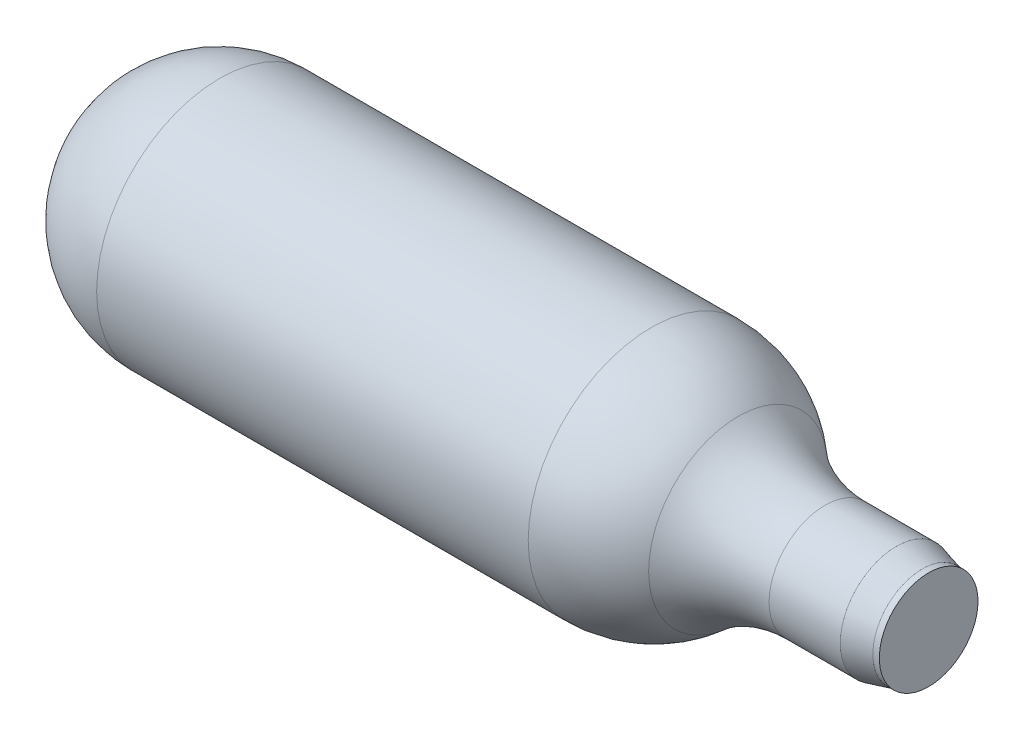
ISO-10303-21;
HEADER;
FILE_DESCRIPTION(('STEP AP214'),'2;1');
FILE_NAME('part.step','',(''),(''),'','','');
FILE_SCHEMA(('AUTOMOTIVE_DESIGN { 1 0 10303 214 1 1 1 1 }'));
ENDSEC;
DATA;
#1=APPLICATION_CONTEXT('core data for automotive mechanical design processes');
#2=APPLICATION_PROTOCOL_DEFINITION('international standard','automotive_design',2000,#1);
#3=PRODUCT_CONTEXT('',#1,'mechanical');
#4=PRODUCT('Part','Part','',(#3));
#5=PRODUCT_RELATED_PRODUCT_CATEGORY('part','',(#4));
#6=PRODUCT_DEFINITION_FORMATION('','',#4);
#7=PRODUCT_DEFINITION_CONTEXT('part definition',#1,'design');
#8=PRODUCT_DEFINITION('design','',#6,#7);
#9=PRODUCT_DEFINITION_SHAPE('','',#8);
#10=(LENGTH_UNIT() NAMED_UNIT(*) SI_UNIT(.MILLI.,.METRE.));
#11=(NAMED_UNIT(*) PLANE_ANGLE_UNIT() SI_UNIT($,.RADIAN.));
#12=(NAMED_UNIT(*) SI_UNIT($,.STERADIAN.) SOLID_ANGLE_UNIT());
#13=UNCERTAINTY_MEASURE_WITH_UNIT(LENGTH_MEASURE(1.E-05),#10,'distance_accuracy_value','');
#14=(GEOMETRIC_REPRESENTATION_CONTEXT(3) GLOBAL_UNCERTAINTY_ASSIGNED_CONTEXT((#13)) GLOBAL_UNIT_ASSIGNED_CONTEXT((#10,
#11,#12)) REPRESENTATION_CONTEXT('',''));
#15=CARTESIAN_POINT('',(0.,0.,0.));
#16=DIRECTION('',(0.,0.,1.));
#17=DIRECTION('',(1.,0.,0.));
#18=AXIS2_PLACEMENT_3D('',#15,#16,#17);
#19=CARTESIAN_POINT('',(71.9038755659482,0.,0.));
#20=DIRECTION('',(-1.,0.,0.));
#21=DIRECTION('',(0.,0.,1.));
#22=AXIS2_PLACEMENT_3D('',#19,#20,#21);
#23=CYLINDRICAL_SURFACE('',#22,4.325);
#24=CARTESIAN_POINT('',(61.75,0.,0.));
#25=DIRECTION('',(1.,0.,0.));
#26=DIRECTION('',(0.,0.,-1.));
#27=AXIS2_PLACEMENT_3D('',#24,#25,#26);
#28=CIRCLE('',#27,4.325);
#29=CARTESIAN_POINT('',(61.75,0.,-4.325));
#30=VERTEX_POINT('',#29);
#31=EDGE_CURVE('E11',#30,#30,#28,.F.);
#32=ORIENTED_EDGE('',*,*,#31,.T.);
#33=EDGE_LOOP('',(#32));
#34=FACE_BOUND('',#33,.T.);
#35=CARTESIAN_POINT('',(56.25,0.,0.));
#36=DIRECTION('',(-1.,0.,0.));
#37=DIRECTION('',(0.,0.,1.));
#38=AXIS2_PLACEMENT_3D('',#35,#36,#37);
#39=CIRCLE('',#38,4.325);
#40=CARTESIAN_POINT('',(56.25,0.,4.325));
#41=VERTEX_POINT('',#40);
#42=EDGE_CURVE('E53',#41,#41,#39,.T.);
#43=ORIENTED_EDGE('',*,*,#42,.F.);
#44=EDGE_LOOP('',(#43));
#45=FACE_BOUND('',#44,.T.);
#46=ADVANCED_FACE('F33',(#34,#45),#23,.T.);
#47=CARTESIAN_POINT('',(9.5,0.,0.));
#48=DIRECTION('',(-1.,0.,0.));
#49=DIRECTION('',(0.,1.,0.));
#50=AXIS2_PLACEMENT_3D('',#47,#48,#49);
#51=SPHERICAL_SURFACE('',#50,9.5);
#52=CARTESIAN_POINT('',(9.5,0.,0.));
#53=DIRECTION('',(-1.,0.,0.));
#54=DIRECTION('',(0.,0.,1.));
#55=AXIS2_PLACEMENT_3D('',#52,#53,#54);
#56=CIRCLE('',#55,9.5);
#57=CARTESIAN_POINT('',(9.5,0.,9.5));
#58=VERTEX_POINT('',#57);
#59=EDGE_CURVE('E40',#58,#58,#56,.T.);
#60=ORIENTED_EDGE('',*,*,#59,.T.);
#61=EDGE_LOOP('',(#60));
#62=FACE_BOUND('',#61,.T.);
#63=ADVANCED_FACE('F75',(#62),#51,.T.);
#64=CARTESIAN_POINT('',(71.9038755659482,0.,0.));
#65=DIRECTION('',(-1.,0.,0.));
#66=DIRECTION('',(0.,0.,1.));
#67=AXIS2_PLACEMENT_3D('',#64,#65,#66);
#68=CYLINDRICAL_SURFACE('',#67,9.5);
#69=ORIENTED_EDGE('',*,*,#59,.F.);
#70=EDGE_LOOP('',(#69));
#71=FACE_BOUND('',#70,.T.);
#72=CARTESIAN_POINT('',(42.825419000952,0.,0.));
#73=DIRECTION('',(-1.,0.,0.));
#74=DIRECTION('',(0.,0.,1.));
#75=AXIS2_PLACEMENT_3D('',#72,#73,#74);
#76=CIRCLE('',#75,9.5);
#77=CARTESIAN_POINT('',(42.825419000952,0.,9.5));
#78=VERTEX_POINT('',#77);
#79=EDGE_CURVE('E44',#78,#78,#76,.T.);
#80=ORIENTED_EDGE('',*,*,#79,.T.);
#81=EDGE_LOOP('',(#80));
#82=FACE_BOUND('',#81,.T.);
#83=ADVANCED_FACE('F80',(#71,#82),#68,.T.);
#84=CARTESIAN_POINT('',(42.825419000952,0.,0.));
#85=DIRECTION('',(-1.,0.,0.));
#86=DIRECTION('',(0.,0.,1.));
#87=AXIS2_PLACEMENT_3D('',#84,#85,#86);
#88=DEGENERATE_TOROIDAL_SURFACE('',#87,0.499999999999999,10.,.F.);
#89=ORIENTED_EDGE('',*,*,#79,.F.);
#90=EDGE_LOOP('',(#89));
#91=FACE_BOUND('',#90,.T.);
#92=CARTESIAN_POINT('',(49.537709500476,0.,0.));
#93=DIRECTION('',(-1.,0.,0.));
#94=DIRECTION('',(0.,0.,1.));
#95=AXIS2_PLACEMENT_3D('',#92,#93,#94);
#96=CIRCLE('',#95,6.9125);
#97=CARTESIAN_POINT('',(49.537709500476,0.,6.9125));
#98=VERTEX_POINT('',#97);
#99=EDGE_CURVE('E48',#98,#98,#96,.T.);
#100=ORIENTED_EDGE('',*,*,#99,.T.);
#101=EDGE_LOOP('',(#100));
#102=FACE_BOUND('',#101,.T.);
#103=ADVANCED_FACE('F87',(#91,#102),#88,.F.);
#104=CARTESIAN_POINT('',(56.25,0.,0.));
#105=DIRECTION('',(-1.,0.,0.));
#106=DIRECTION('',(0.,0.,1.));
#107=AXIS2_PLACEMENT_3D('',#104,#105,#106);
#108=TOROIDAL_SURFACE('',#107,14.325,10.);
#109=ORIENTED_EDGE('',*,*,#99,.F.);
#110=EDGE_LOOP('',(#109));
#111=FACE_BOUND('',#110,.T.);
#112=ORIENTED_EDGE('',*,*,#42,.T.);
#113=EDGE_LOOP('',(#112));
#114=FACE_BOUND('',#113,.T.);
#115=ADVANCED_FACE('F84',(#111,#114),#108,.F.);
#116=CARTESIAN_POINT('',(63.75,0.,0.));
#117=DIRECTION('',(1.,0.,0.));
#118=DIRECTION('',(0.,0.,-1.));
#119=AXIS2_PLACEMENT_3D('',#116,#117,#118);
#120=CYLINDRICAL_SURFACE('',#119,3.81);
#121=CARTESIAN_POINT('',(63.75,0.,0.));
#122=DIRECTION('',(1.,0.,0.));
#123=DIRECTION('',(0.,0.,-1.));
#124=AXIS2_PLACEMENT_3D('',#121,#122,#123);
#125=CIRCLE('',#124,3.81);
#126=CARTESIAN_POINT('',(63.75,0.,-3.81));
#127=VERTEX_POINT('',#126);
#128=EDGE_CURVE('E56',#127,#127,#125,.T.);
#129=ORIENTED_EDGE('',*,*,#128,.T.);
#130=EDGE_LOOP('',(#129));
#131=FACE_BOUND('',#130,.T.);
#132=CARTESIAN_POINT('',(64.25,0.,0.));
#133=DIRECTION('',(1.,0.,0.));
#134=DIRECTION('',(0.,0.,-1.));
#135=AXIS2_PLACEMENT_3D('',#132,#133,#134);
#136=CIRCLE('',#135,3.81);
#137=CARTESIAN_POINT('',(64.25,0.,-3.81));
#138=VERTEX_POINT('',#137);
#139=EDGE_CURVE('E57',#138,#138,#136,.T.);
#140=ORIENTED_EDGE('',*,*,#139,.F.);
#141=EDGE_LOOP('',(#140));
#142=FACE_BOUND('',#141,.T.);
#143=ADVANCED_FACE('F63',(#131,#142),#120,.T.);
#144=CARTESIAN_POINT('',(64.25,4.325,0.));
#145=DIRECTION('',(-1.,0.,0.));
#146=DIRECTION('',(0.,0.,1.));
#147=AXIS2_PLACEMENT_3D('',#144,#145,#146);
#148=PLANE('',#147);
#149=ORIENTED_EDGE('',*,*,#139,.T.);
#150=EDGE_LOOP('',(#149));
#151=FACE_BOUND('',#150,.T.);
#152=ADVANCED_FACE('F67',(#151),#148,.F.);
#153=CARTESIAN_POINT('',(63.75,0.,0.));
#154=DIRECTION('',(-1.,0.,0.));
#155=DIRECTION('',(0.,0.,1.));
#156=AXIS2_PLACEMENT_3D('',#153,#154,#155);
#157=CONICAL_SURFACE('',#156,3.81,0.252024935234636);
#158=ORIENTED_EDGE('',*,*,#31,.F.);
#159=EDGE_LOOP('',(#158));
#160=FACE_BOUND('',#159,.T.);
#161=ORIENTED_EDGE('',*,*,#128,.F.);
#162=EDGE_LOOP('',(#161));
#163=FACE_BOUND('',#162,.T.);
#164=ADVANCED_FACE('F35',(#160,#163),#157,.T.);
#165=CLOSED_SHELL('',(#46,#63,#83,#103,#115,#143,#152,#164));
#166=MANIFOLD_SOLID_BREP('B2',#165);
#167=ADVANCED_BREP_SHAPE_REPRESENTATION('',(#18,#166),#14);
#168=SHAPE_DEFINITION_REPRESENTATION(#9,#167);
ENDSEC;
END-ISO-10303-21;
